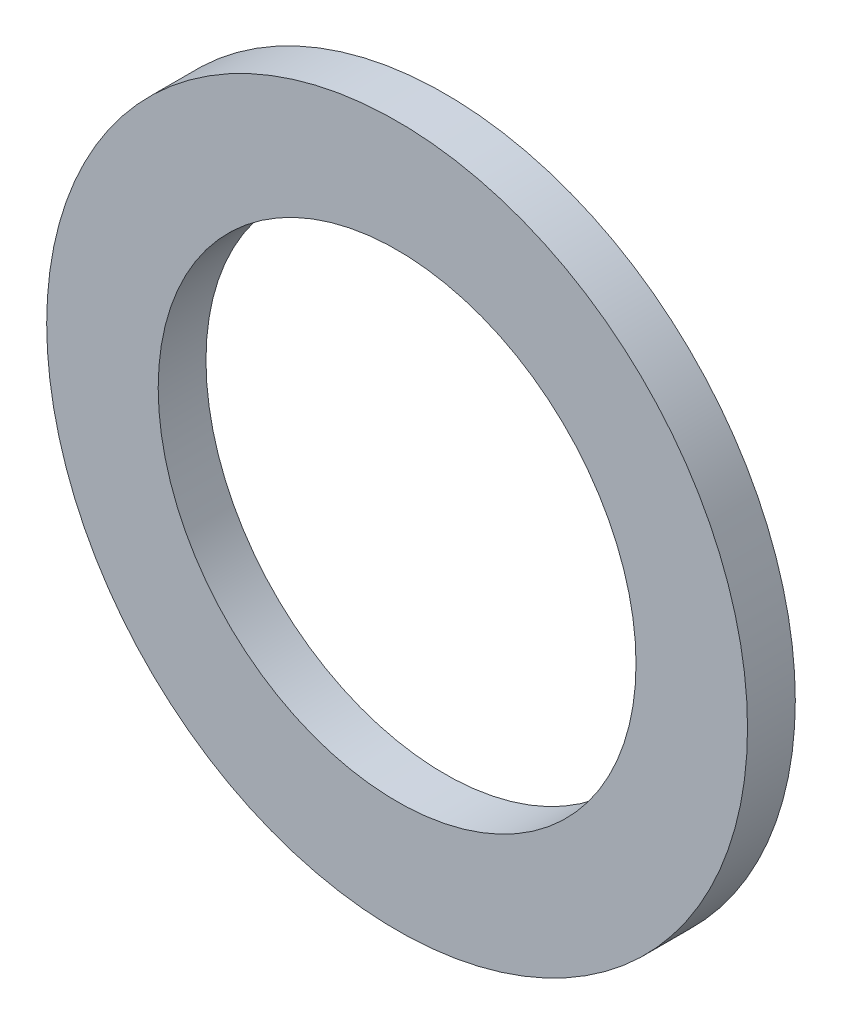
ISO-10303-21;
HEADER;
FILE_DESCRIPTION(('STEP AP214'),'2;1');
FILE_NAME('part.step','',(''),(''),'','','');
FILE_SCHEMA(('AUTOMOTIVE_DESIGN { 1 0 10303 214 1 1 1 1 }'));
ENDSEC;
DATA;
#1=APPLICATION_CONTEXT('core data for automotive mechanical design processes');
#2=APPLICATION_PROTOCOL_DEFINITION('international standard','automotive_design',2000,#1);
#3=PRODUCT_CONTEXT('',#1,'mechanical');
#4=PRODUCT('Part','Part','',(#3));
#5=PRODUCT_RELATED_PRODUCT_CATEGORY('part','',(#4));
#6=PRODUCT_DEFINITION_FORMATION('','',#4);
#7=PRODUCT_DEFINITION_CONTEXT('part definition',#1,'design');
#8=PRODUCT_DEFINITION('design','',#6,#7);
#9=PRODUCT_DEFINITION_SHAPE('','',#8);
#10=(LENGTH_UNIT() NAMED_UNIT(*) SI_UNIT(.MILLI.,.METRE.));
#11=(NAMED_UNIT(*) PLANE_ANGLE_UNIT() SI_UNIT($,.RADIAN.));
#12=(NAMED_UNIT(*) SI_UNIT($,.STERADIAN.) SOLID_ANGLE_UNIT());
#13=UNCERTAINTY_MEASURE_WITH_UNIT(LENGTH_MEASURE(1.E-05),#10,'distance_accuracy_value','');
#14=(GEOMETRIC_REPRESENTATION_CONTEXT(3) GLOBAL_UNCERTAINTY_ASSIGNED_CONTEXT((#13)) GLOBAL_UNIT_ASSIGNED_CONTEXT((#10,
#11,#12)) REPRESENTATION_CONTEXT('',''));
#15=CARTESIAN_POINT('',(0.,0.,0.));
#16=DIRECTION('',(0.,0.,1.));
#17=DIRECTION('',(1.,0.,0.));
#18=AXIS2_PLACEMENT_3D('',#15,#16,#17);
#19=CARTESIAN_POINT('',(0.,0.,1.5));
#20=DIRECTION('',(0.,0.,-1.));
#21=DIRECTION('',(-1.,0.,0.));
#22=AXIS2_PLACEMENT_3D('',#19,#20,#21);
#23=CYLINDRICAL_SURFACE('',#22,11.);
#24=CARTESIAN_POINT('',(0.,0.,1.5));
#25=DIRECTION('',(0.,0.,1.));
#26=DIRECTION('',(1.,0.,0.));
#27=AXIS2_PLACEMENT_3D('',#24,#25,#26);
#28=CIRCLE('',#27,11.);
#29=CARTESIAN_POINT('',(11.,0.,1.5));
#30=VERTEX_POINT('',#29);
#31=EDGE_CURVE('E10',#30,#30,#28,.T.);
#32=ORIENTED_EDGE('',*,*,#31,.F.);
#33=EDGE_LOOP('',(#32));
#34=FACE_BOUND('',#33,.T.);
#35=CARTESIAN_POINT('',(0.,0.,0.));
#36=DIRECTION('',(0.,0.,1.));
#37=DIRECTION('',(1.,0.,0.));
#38=AXIS2_PLACEMENT_3D('',#35,#36,#37);
#39=CIRCLE('',#38,11.);
#40=CARTESIAN_POINT('',(11.,0.,0.));
#41=VERTEX_POINT('',#40);
#42=EDGE_CURVE('E33',#41,#41,#39,.T.);
#43=ORIENTED_EDGE('',*,*,#42,.T.);
#44=EDGE_LOOP('',(#43));
#45=FACE_BOUND('',#44,.T.);
#46=ADVANCED_FACE('F27',(#34,#45),#23,.T.);
#47=CARTESIAN_POINT('',(0.,0.,1.5));
#48=DIRECTION('',(0.,0.,1.));
#49=DIRECTION('',(1.,0.,0.));
#50=AXIS2_PLACEMENT_3D('',#47,#48,#49);
#51=PLANE('',#50);
#52=CARTESIAN_POINT('',(0.,0.,1.5));
#53=DIRECTION('',(0.,0.,1.));
#54=DIRECTION('',(1.,0.,0.));
#55=AXIS2_PLACEMENT_3D('',#52,#53,#54);
#56=CIRCLE('',#55,7.5);
#57=CARTESIAN_POINT('',(7.5,0.,1.5));
#58=VERTEX_POINT('',#57);
#59=EDGE_CURVE('E41',#58,#58,#56,.T.);
#60=ORIENTED_EDGE('',*,*,#59,.F.);
#61=EDGE_LOOP('',(#60));
#62=FACE_BOUND('',#61,.T.);
#63=ORIENTED_EDGE('',*,*,#31,.T.);
#64=EDGE_LOOP('',(#63));
#65=FACE_BOUND('',#64,.T.);
#66=ADVANCED_FACE('F49',(#62,#65),#51,.T.);
#67=CARTESIAN_POINT('',(0.,0.,0.));
#68=DIRECTION('',(0.,0.,1.));
#69=DIRECTION('',(1.,0.,0.));
#70=AXIS2_PLACEMENT_3D('',#67,#68,#69);
#71=PLANE('',#70);
#72=CARTESIAN_POINT('',(0.,0.,0.));
#73=DIRECTION('',(0.,0.,1.));
#74=DIRECTION('',(1.,0.,0.));
#75=AXIS2_PLACEMENT_3D('',#72,#73,#74);
#76=CIRCLE('',#75,7.5);
#77=CARTESIAN_POINT('',(7.5,0.,0.));
#78=VERTEX_POINT('',#77);
#79=EDGE_CURVE('E37',#78,#78,#76,.T.);
#80=ORIENTED_EDGE('',*,*,#79,.T.);
#81=EDGE_LOOP('',(#80));
#82=FACE_BOUND('',#81,.T.);
#83=ORIENTED_EDGE('',*,*,#42,.F.);
#84=EDGE_LOOP('',(#83));
#85=FACE_BOUND('',#84,.T.);
#86=ADVANCED_FACE('F51',(#82,#85),#71,.F.);
#87=CARTESIAN_POINT('',(0.,0.,0.));
#88=DIRECTION('',(0.,0.,1.));
#89=DIRECTION('',(1.,0.,0.));
#90=AXIS2_PLACEMENT_3D('',#87,#88,#89);
#91=CYLINDRICAL_SURFACE('',#90,7.5);
#92=ORIENTED_EDGE('',*,*,#79,.F.);
#93=EDGE_LOOP('',(#92));
#94=FACE_BOUND('',#93,.T.);
#95=ORIENTED_EDGE('',*,*,#59,.T.);
#96=EDGE_LOOP('',(#95));
#97=FACE_BOUND('',#96,.T.);
#98=ADVANCED_FACE('F47',(#94,#97),#91,.F.);
#99=CLOSED_SHELL('',(#46,#66,#86,#98));
#100=MANIFOLD_SOLID_BREP('B2',#99);
#101=ADVANCED_BREP_SHAPE_REPRESENTATION('',(#18,#100),#14);
#102=SHAPE_DEFINITION_REPRESENTATION(#9,#101);
ENDSEC;
END-ISO-10303-21;
